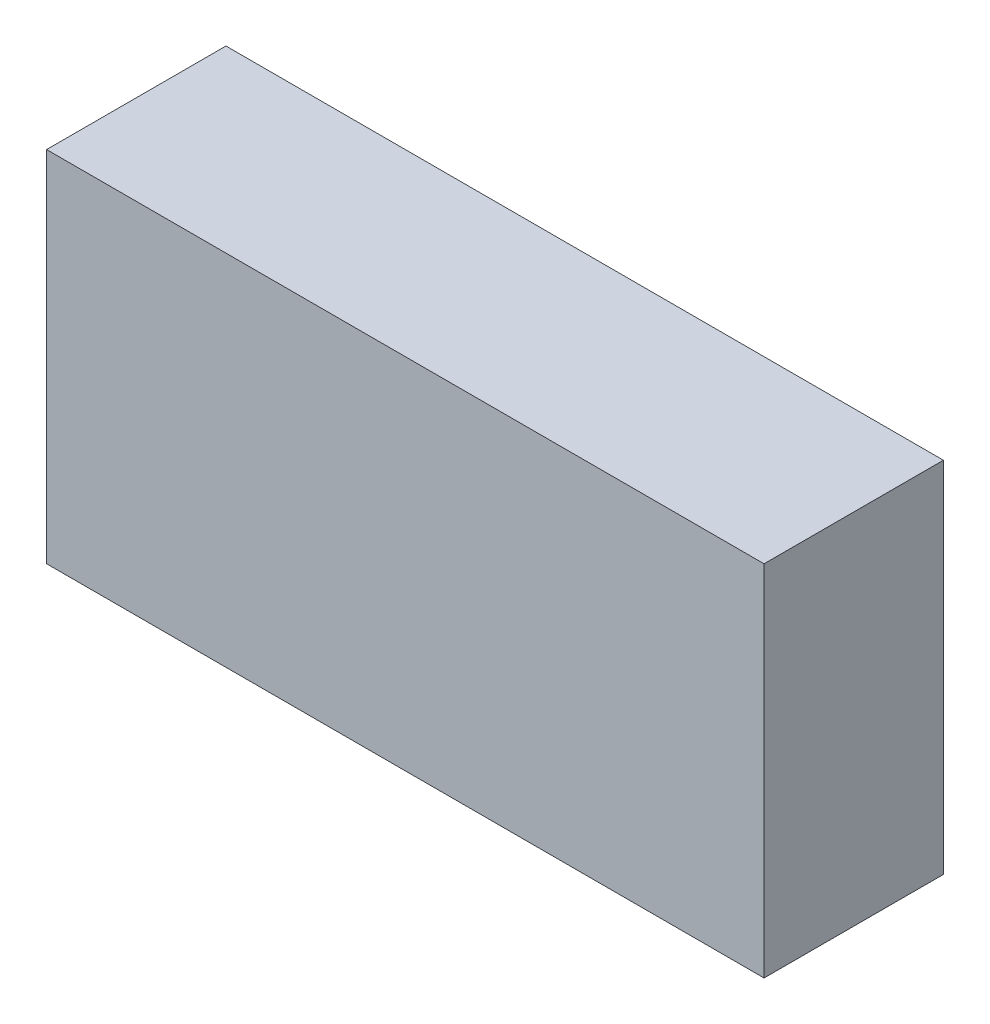
ISO-10303-21;
HEADER;
FILE_DESCRIPTION(('STEP AP214'),'2;1');
FILE_NAME('part.step','',(''),(''),'','','');
FILE_SCHEMA(('AUTOMOTIVE_DESIGN { 1 0 10303 214 1 1 1 1 }'));
ENDSEC;
DATA;
#1=APPLICATION_CONTEXT('core data for automotive mechanical design processes');
#2=APPLICATION_PROTOCOL_DEFINITION('international standard','automotive_design',2000,#1);
#3=PRODUCT_CONTEXT('',#1,'mechanical');
#4=PRODUCT('Part','Part','',(#3));
#5=PRODUCT_RELATED_PRODUCT_CATEGORY('part','',(#4));
#6=PRODUCT_DEFINITION_FORMATION('','',#4);
#7=PRODUCT_DEFINITION_CONTEXT('part definition',#1,'design');
#8=PRODUCT_DEFINITION('design','',#6,#7);
#9=PRODUCT_DEFINITION_SHAPE('','',#8);
#10=(LENGTH_UNIT() NAMED_UNIT(*) SI_UNIT(.MILLI.,.METRE.));
#11=(NAMED_UNIT(*) PLANE_ANGLE_UNIT() SI_UNIT($,.RADIAN.));
#12=(NAMED_UNIT(*) SI_UNIT($,.STERADIAN.) SOLID_ANGLE_UNIT());
#13=UNCERTAINTY_MEASURE_WITH_UNIT(LENGTH_MEASURE(1.E-05),#10,'distance_accuracy_value','');
#14=(GEOMETRIC_REPRESENTATION_CONTEXT(3) GLOBAL_UNCERTAINTY_ASSIGNED_CONTEXT((#13)) GLOBAL_UNIT_ASSIGNED_CONTEXT((#10,
#11,#12)) REPRESENTATION_CONTEXT('',''));
#15=CARTESIAN_POINT('',(0.,0.,0.));
#16=DIRECTION('',(0.,0.,1.));
#17=DIRECTION('',(1.,0.,0.));
#18=AXIS2_PLACEMENT_3D('',#15,#16,#17);
#19=CARTESIAN_POINT('',(-20.,10.,10.));
#20=DIRECTION('',(1.,0.,0.));
#21=DIRECTION('',(0.,0.,-1.));
#22=AXIS2_PLACEMENT_3D('',#19,#20,#21);
#23=PLANE('',#22);
#24=DIRECTION('',(0.,-1.,0.));
#25=VECTOR('',#24,1.);
#26=CARTESIAN_POINT('',(-20.,10.,0.));
#27=LINE('',#26,#25);
#28=CARTESIAN_POINT('',(-20.,10.,0.));
#29=VERTEX_POINT('',#28);
#30=CARTESIAN_POINT('',(-20.,-10.,0.));
#31=VERTEX_POINT('',#30);
#32=EDGE_CURVE('E105',#29,#31,#27,.T.);
#33=ORIENTED_EDGE('',*,*,#32,.T.);
#34=DIRECTION('',(0.,0.,-1.));
#35=VECTOR('',#34,1.);
#36=CARTESIAN_POINT('',(-20.,-10.,10.));
#37=LINE('',#36,#35);
#38=CARTESIAN_POINT('',(-20.,-10.,10.));
#39=VERTEX_POINT('',#38);
#40=EDGE_CURVE('E11',#39,#31,#37,.T.);
#41=ORIENTED_EDGE('',*,*,#40,.F.);
#42=DIRECTION('',(0.,-1.,0.));
#43=VECTOR('',#42,1.);
#44=CARTESIAN_POINT('',(-20.,10.,10.));
#45=LINE('',#44,#43);
#46=CARTESIAN_POINT('',(-20.,10.,10.));
#47=VERTEX_POINT('',#46);
#48=EDGE_CURVE('E89',#47,#39,#45,.T.);
#49=ORIENTED_EDGE('',*,*,#48,.F.);
#50=DIRECTION('',(0.,0.,-1.));
#51=VECTOR('',#50,1.);
#52=CARTESIAN_POINT('',(-20.,10.,10.));
#53=LINE('',#52,#51);
#54=EDGE_CURVE('E98',#47,#29,#53,.T.);
#55=ORIENTED_EDGE('',*,*,#54,.T.);
#56=EDGE_LOOP('',(#33,#41,#49,#55));
#57=FACE_BOUND('',#56,.T.);
#58=ADVANCED_FACE('F39',(#57),#23,.F.);
#59=CARTESIAN_POINT('',(-20.,-10.,10.));
#60=DIRECTION('',(0.,1.,0.));
#61=DIRECTION('',(0.,0.,1.));
#62=AXIS2_PLACEMENT_3D('',#59,#60,#61);
#63=PLANE('',#62);
#64=DIRECTION('',(1.,0.,0.));
#65=VECTOR('',#64,1.);
#66=CARTESIAN_POINT('',(-20.,-10.,0.));
#67=LINE('',#66,#65);
#68=CARTESIAN_POINT('',(20.,-10.,0.));
#69=VERTEX_POINT('',#68);
#70=EDGE_CURVE('E94',#31,#69,#67,.T.);
#71=ORIENTED_EDGE('',*,*,#70,.T.);
#72=DIRECTION('',(0.,0.,-1.));
#73=VECTOR('',#72,1.);
#74=CARTESIAN_POINT('',(20.,-10.,10.));
#75=LINE('',#74,#73);
#76=CARTESIAN_POINT('',(20.,-10.,10.));
#77=VERTEX_POINT('',#76);
#78=EDGE_CURVE('E50',#77,#69,#75,.T.);
#79=ORIENTED_EDGE('',*,*,#78,.F.);
#80=DIRECTION('',(1.,0.,0.));
#81=VECTOR('',#80,1.);
#82=CARTESIAN_POINT('',(-20.,-10.,10.));
#83=LINE('',#82,#81);
#84=EDGE_CURVE('E81',#39,#77,#83,.T.);
#85=ORIENTED_EDGE('',*,*,#84,.F.);
#86=ORIENTED_EDGE('',*,*,#40,.T.);
#87=EDGE_LOOP('',(#71,#79,#85,#86));
#88=FACE_BOUND('',#87,.T.);
#89=ADVANCED_FACE('F91',(#88),#63,.F.);
#90=CARTESIAN_POINT('',(20.,-10.,10.));
#91=DIRECTION('',(-1.,0.,0.));
#92=DIRECTION('',(0.,0.,1.));
#93=AXIS2_PLACEMENT_3D('',#90,#91,#92);
#94=PLANE('',#93);
#95=DIRECTION('',(0.,1.,0.));
#96=VECTOR('',#95,1.);
#97=CARTESIAN_POINT('',(20.,-10.,0.));
#98=LINE('',#97,#96);
#99=CARTESIAN_POINT('',(20.,10.,0.));
#100=VERTEX_POINT('',#99);
#101=EDGE_CURVE('E75',#69,#100,#98,.T.);
#102=ORIENTED_EDGE('',*,*,#101,.T.);
#103=DIRECTION('',(0.,0.,-1.));
#104=VECTOR('',#103,1.);
#105=CARTESIAN_POINT('',(20.,10.,10.));
#106=LINE('',#105,#104);
#107=CARTESIAN_POINT('',(20.,10.,10.));
#108=VERTEX_POINT('',#107);
#109=EDGE_CURVE('E92',#108,#100,#106,.T.);
#110=ORIENTED_EDGE('',*,*,#109,.F.);
#111=DIRECTION('',(0.,1.,0.));
#112=VECTOR('',#111,1.);
#113=CARTESIAN_POINT('',(20.,-10.,10.));
#114=LINE('',#113,#112);
#115=EDGE_CURVE('E86',#77,#108,#114,.T.);
#116=ORIENTED_EDGE('',*,*,#115,.F.);
#117=ORIENTED_EDGE('',*,*,#78,.T.);
#118=EDGE_LOOP('',(#102,#110,#116,#117));
#119=FACE_BOUND('',#118,.T.);
#120=ADVANCED_FACE('F96',(#119),#94,.F.);
#121=CARTESIAN_POINT('',(20.,10.,10.));
#122=DIRECTION('',(0.,-1.,0.));
#123=DIRECTION('',(0.,0.,-1.));
#124=AXIS2_PLACEMENT_3D('',#121,#122,#123);
#125=PLANE('',#124);
#126=DIRECTION('',(-1.,0.,0.));
#127=VECTOR('',#126,1.);
#128=CARTESIAN_POINT('',(20.,10.,0.));
#129=LINE('',#128,#127);
#130=EDGE_CURVE('E79',#100,#29,#129,.T.);
#131=ORIENTED_EDGE('',*,*,#130,.T.);
#132=ORIENTED_EDGE('',*,*,#54,.F.);
#133=DIRECTION('',(-1.,0.,0.));
#134=VECTOR('',#133,1.);
#135=CARTESIAN_POINT('',(20.,10.,10.));
#136=LINE('',#135,#134);
#137=EDGE_CURVE('E54',#108,#47,#136,.T.);
#138=ORIENTED_EDGE('',*,*,#137,.F.);
#139=ORIENTED_EDGE('',*,*,#109,.T.);
#140=EDGE_LOOP('',(#131,#132,#138,#139));
#141=FACE_BOUND('',#140,.T.);
#142=ADVANCED_FACE('F108',(#141),#125,.F.);
#143=CARTESIAN_POINT('',(0.,0.,10.));
#144=DIRECTION('',(0.,0.,1.));
#145=DIRECTION('',(1.,0.,0.));
#146=AXIS2_PLACEMENT_3D('',#143,#144,#145);
#147=PLANE('',#146);
#148=ORIENTED_EDGE('',*,*,#48,.T.);
#149=ORIENTED_EDGE('',*,*,#84,.T.);
#150=ORIENTED_EDGE('',*,*,#115,.T.);
#151=ORIENTED_EDGE('',*,*,#137,.T.);
#152=EDGE_LOOP('',(#148,#149,#150,#151));
#153=FACE_BOUND('',#152,.T.);
#154=ADVANCED_FACE('F88',(#153),#147,.T.);
#155=CARTESIAN_POINT('',(0.,0.,0.));
#156=DIRECTION('',(0.,0.,1.));
#157=DIRECTION('',(1.,0.,0.));
#158=AXIS2_PLACEMENT_3D('',#155,#156,#157);
#159=PLANE('',#158);
#160=ORIENTED_EDGE('',*,*,#32,.F.);
#161=ORIENTED_EDGE('',*,*,#130,.F.);
#162=ORIENTED_EDGE('',*,*,#101,.F.);
#163=ORIENTED_EDGE('',*,*,#70,.F.);
#164=EDGE_LOOP('',(#160,#161,#162,#163));
#165=FACE_BOUND('',#164,.T.);
#166=ADVANCED_FACE('F115',(#165),#159,.F.);
#167=CLOSED_SHELL('',(#58,#89,#120,#142,#154,#166));
#168=MANIFOLD_SOLID_BREP('B2',#167);
#169=ADVANCED_BREP_SHAPE_REPRESENTATION('',(#18,#168),#14);
#170=SHAPE_DEFINITION_REPRESENTATION(#9,#169);
ENDSEC;
END-ISO-10303-21;
